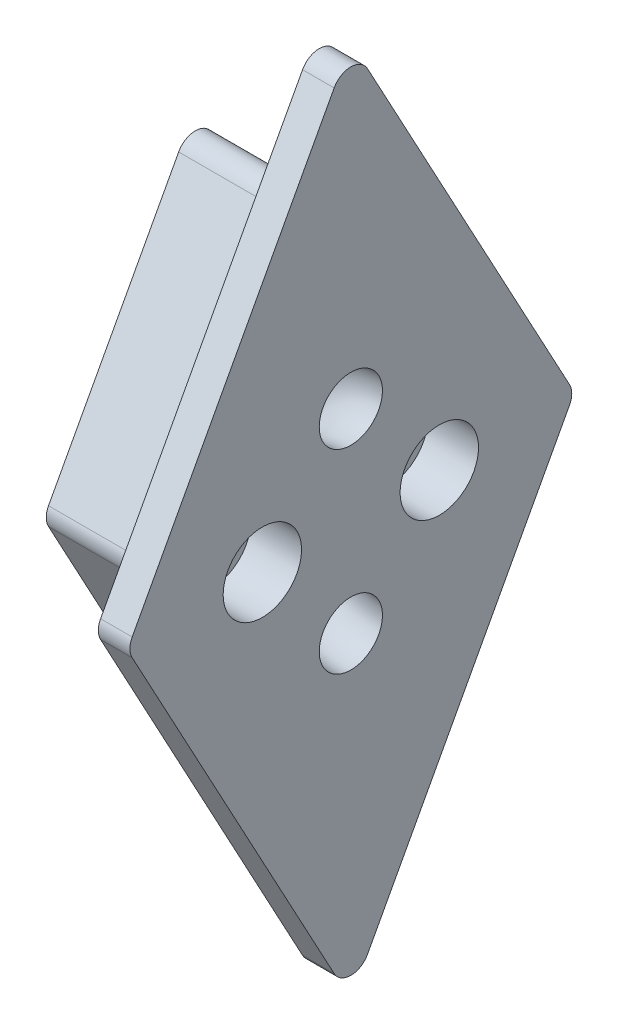
ISO-10303-21;
HEADER;
FILE_DESCRIPTION(('STEP AP214'),'2;1');
FILE_NAME('part.step','',(''),(''),'','','');
FILE_SCHEMA(('AUTOMOTIVE_DESIGN { 1 0 10303 214 1 1 1 1 }'));
ENDSEC;
DATA;
#1=APPLICATION_CONTEXT('core data for automotive mechanical design processes');
#2=APPLICATION_PROTOCOL_DEFINITION('international standard','automotive_design',2000,#1);
#3=PRODUCT_CONTEXT('',#1,'mechanical');
#4=PRODUCT('Part','Part','',(#3));
#5=PRODUCT_RELATED_PRODUCT_CATEGORY('part','',(#4));
#6=PRODUCT_DEFINITION_FORMATION('','',#4);
#7=PRODUCT_DEFINITION_CONTEXT('part definition',#1,'design');
#8=PRODUCT_DEFINITION('design','',#6,#7);
#9=PRODUCT_DEFINITION_SHAPE('','',#8);
#10=(LENGTH_UNIT() NAMED_UNIT(*) SI_UNIT(.MILLI.,.METRE.));
#11=(NAMED_UNIT(*) PLANE_ANGLE_UNIT() SI_UNIT($,.RADIAN.));
#12=(NAMED_UNIT(*) SI_UNIT($,.STERADIAN.) SOLID_ANGLE_UNIT());
#13=UNCERTAINTY_MEASURE_WITH_UNIT(LENGTH_MEASURE(1.E-05),#10,'distance_accuracy_value','');
#14=(GEOMETRIC_REPRESENTATION_CONTEXT(3) GLOBAL_UNCERTAINTY_ASSIGNED_CONTEXT((#13)) GLOBAL_UNIT_ASSIGNED_CONTEXT((#10,
#11,#12)) REPRESENTATION_CONTEXT('',''));
#15=CARTESIAN_POINT('',(0.,0.,0.));
#16=DIRECTION('',(0.,0.,1.));
#17=DIRECTION('',(1.,0.,0.));
#18=AXIS2_PLACEMENT_3D('',#15,#16,#17);
#19=CARTESIAN_POINT('',(12.446,0.,-15.24));
#20=DIRECTION('',(0.,-0.474689449376783,0.880153354052785));
#21=DIRECTION('',(0.,-0.880153354052785,-0.474689449376783));
#22=AXIS2_PLACEMENT_3D('',#19,#20,#21);
#23=PLANE('',#22);
#24=DIRECTION('',(0.,0.880153354052785,0.474689449376783));
#25=VECTOR('',#24,1.);
#26=CARTESIAN_POINT('',(12.446,0.,-15.24));
#27=LINE('',#26,#25);
#28=CARTESIAN_POINT('',(12.446,0.904283401062772,-14.7522965926852));
#29=VERTEX_POINT('',#28);
#30=CARTESIAN_POINT('',(12.446,25.1486333247317,-1.67669213947054));
#31=VERTEX_POINT('',#30);
#32=EDGE_CURVE('E210',#29,#31,#27,.T.);
#33=ORIENTED_EDGE('',*,*,#32,.F.);
#34=DIRECTION('',(-1.,0.,0.));
#35=VECTOR('',#34,1.);
#36=CARTESIAN_POINT('',(12.446,0.904283401062771,-14.7522965926852));
#37=LINE('',#36,#35);
#38=CARTESIAN_POINT('',(0.,0.904283401062772,-14.7522965926852));
#39=VERTEX_POINT('',#38);
#40=EDGE_CURVE('E277',#29,#39,#37,.T.);
#41=ORIENTED_EDGE('',*,*,#40,.T.);
#42=DIRECTION('',(0.,0.880153354052785,0.474689449376783));
#43=VECTOR('',#42,1.);
#44=CARTESIAN_POINT('',(0.,0.,-15.24));
#45=LINE('',#44,#43);
#46=CARTESIAN_POINT('',(0.,25.1486333247317,-1.67669213947054));
#47=VERTEX_POINT('',#46);
#48=EDGE_CURVE('E223',#39,#47,#45,.T.);
#49=ORIENTED_EDGE('',*,*,#48,.T.);
#50=DIRECTION('',(-1.,0.,0.));
#51=VECTOR('',#50,1.);
#52=CARTESIAN_POINT('',(12.446,25.1486333247317,-1.67669213947054));
#53=LINE('',#52,#51);
#54=EDGE_CURVE('E275',#47,#31,#53,.F.);
#55=ORIENTED_EDGE('',*,*,#54,.T.);
#56=EDGE_LOOP('',(#33,#41,#49,#55));
#57=FACE_BOUND('',#56,.T.);
#58=ADVANCED_FACE('F47',(#57),#23,.F.);
#59=CARTESIAN_POINT('',(12.446,0.,15.24));
#60=DIRECTION('',(0.,-0.474689449376783,-0.880153354052785));
#61=DIRECTION('',(0.,0.880153354052785,-0.474689449376783));
#62=AXIS2_PLACEMENT_3D('',#59,#60,#61);
#63=PLANE('',#62);
#64=DIRECTION('',(0.,-0.880153354052785,0.474689449376783));
#65=VECTOR('',#64,1.);
#66=CARTESIAN_POINT('',(0.,0.,15.24));
#67=LINE('',#66,#65);
#68=CARTESIAN_POINT('',(0.,25.1486333247317,1.67669213947056));
#69=VERTEX_POINT('',#68);
#70=CARTESIAN_POINT('',(0.,0.904283401062768,14.7522965926853));
#71=VERTEX_POINT('',#70);
#72=EDGE_CURVE('E226',#69,#71,#67,.T.);
#73=ORIENTED_EDGE('',*,*,#72,.T.);
#74=DIRECTION('',(-1.,0.,0.));
#75=VECTOR('',#74,1.);
#76=CARTESIAN_POINT('',(12.446,0.904283401062769,14.7522965926853));
#77=LINE('',#76,#75);
#78=CARTESIAN_POINT('',(12.446,0.904283401062768,14.7522965926853));
#79=VERTEX_POINT('',#78);
#80=EDGE_CURVE('E282',#71,#79,#77,.F.);
#81=ORIENTED_EDGE('',*,*,#80,.T.);
#82=DIRECTION('',(0.,-0.880153354052785,0.474689449376783));
#83=VECTOR('',#82,1.);
#84=CARTESIAN_POINT('',(12.446,0.,15.24));
#85=LINE('',#84,#83);
#86=CARTESIAN_POINT('',(12.446,25.1486333247317,1.67669213947056));
#87=VERTEX_POINT('',#86);
#88=EDGE_CURVE('E213',#87,#79,#85,.T.);
#89=ORIENTED_EDGE('',*,*,#88,.F.);
#90=DIRECTION('',(-1.,0.,0.));
#91=VECTOR('',#90,1.);
#92=CARTESIAN_POINT('',(12.446,25.1486333247317,1.67669213947056));
#93=LINE('',#92,#91);
#94=EDGE_CURVE('E280',#87,#69,#93,.T.);
#95=ORIENTED_EDGE('',*,*,#94,.T.);
#96=EDGE_LOOP('',(#73,#81,#89,#95));
#97=FACE_BOUND('',#96,.T.);
#98=ADVANCED_FACE('F330',(#97),#63,.F.);
#99=CARTESIAN_POINT('',(12.446,-28.2575,0.));
#100=DIRECTION('',(0.,0.474689449376783,-0.880153354052785));
#101=DIRECTION('',(0.,0.880153354052785,0.474689449376783));
#102=AXIS2_PLACEMENT_3D('',#99,#100,#101);
#103=PLANE('',#102);
#104=DIRECTION('',(0.,-0.880153354052785,-0.474689449376783));
#105=VECTOR('',#104,1.);
#106=CARTESIAN_POINT('',(0.,-28.2575,0.));
#107=LINE('',#106,#105);
#108=CARTESIAN_POINT('',(0.,-0.904283401062779,14.7522965926852));
#109=VERTEX_POINT('',#108);
#110=CARTESIAN_POINT('',(0.,-25.1486333247317,1.67669213947056));
#111=VERTEX_POINT('',#110);
#112=EDGE_CURVE('E228',#109,#111,#107,.T.);
#113=ORIENTED_EDGE('',*,*,#112,.T.);
#114=DIRECTION('',(-1.,0.,0.));
#115=VECTOR('',#114,1.);
#116=CARTESIAN_POINT('',(12.446,-25.1486333247317,1.67669213947056));
#117=LINE('',#116,#115);
#118=CARTESIAN_POINT('',(12.446,-25.1486333247317,1.67669213947056));
#119=VERTEX_POINT('',#118);
#120=EDGE_CURVE('E273',#111,#119,#117,.F.);
#121=ORIENTED_EDGE('',*,*,#120,.T.);
#122=DIRECTION('',(0.,-0.880153354052785,-0.474689449376783));
#123=VECTOR('',#122,1.);
#124=CARTESIAN_POINT('',(12.446,-28.2575,0.));
#125=LINE('',#124,#123);
#126=CARTESIAN_POINT('',(12.446,-0.904283401062779,14.7522965926852));
#127=VERTEX_POINT('',#126);
#128=EDGE_CURVE('E217',#127,#119,#125,.T.);
#129=ORIENTED_EDGE('',*,*,#128,.F.);
#130=DIRECTION('',(-1.,0.,0.));
#131=VECTOR('',#130,1.);
#132=CARTESIAN_POINT('',(12.446,-0.904283401062779,14.7522965926852));
#133=LINE('',#132,#131);
#134=EDGE_CURVE('E270',#127,#109,#133,.T.);
#135=ORIENTED_EDGE('',*,*,#134,.T.);
#136=EDGE_LOOP('',(#113,#121,#129,#135));
#137=FACE_BOUND('',#136,.T.);
#138=ADVANCED_FACE('F336',(#137),#103,.F.);
#139=CARTESIAN_POINT('',(12.446,-28.2575,0.));
#140=DIRECTION('',(0.,0.474689449376783,0.880153354052785));
#141=DIRECTION('',(0.,-0.880153354052785,0.474689449376783));
#142=AXIS2_PLACEMENT_3D('',#139,#140,#141);
#143=PLANE('',#142);
#144=DIRECTION('',(0.,0.880153354052785,-0.474689449376783));
#145=VECTOR('',#144,1.);
#146=CARTESIAN_POINT('',(12.446,-28.2575,0.));
#147=LINE('',#146,#145);
#148=CARTESIAN_POINT('',(12.446,-25.1486333247317,-1.67669213947055));
#149=VERTEX_POINT('',#148);
#150=CARTESIAN_POINT('',(12.446,-0.904283401062765,-14.7522965926852));
#151=VERTEX_POINT('',#150);
#152=EDGE_CURVE('E220',#149,#151,#147,.T.);
#153=ORIENTED_EDGE('',*,*,#152,.F.);
#154=DIRECTION('',(-1.,0.,0.));
#155=VECTOR('',#154,1.);
#156=CARTESIAN_POINT('',(12.446,-25.1486333247317,-1.67669213947055));
#157=LINE('',#156,#155);
#158=CARTESIAN_POINT('',(0.,-25.1486333247317,-1.67669213947055));
#159=VERTEX_POINT('',#158);
#160=EDGE_CURVE('E261',#149,#159,#157,.T.);
#161=ORIENTED_EDGE('',*,*,#160,.T.);
#162=DIRECTION('',(0.,0.880153354052785,-0.474689449376783));
#163=VECTOR('',#162,1.);
#164=CARTESIAN_POINT('',(0.,-28.2575,0.));
#165=LINE('',#164,#163);
#166=CARTESIAN_POINT('',(0.,-0.904283401062765,-14.7522965926852));
#167=VERTEX_POINT('',#166);
#168=EDGE_CURVE('E214',#159,#167,#165,.T.);
#169=ORIENTED_EDGE('',*,*,#168,.T.);
#170=DIRECTION('',(-1.,0.,0.));
#171=VECTOR('',#170,1.);
#172=CARTESIAN_POINT('',(12.446,-0.904283401062769,-14.7522965926852));
#173=LINE('',#172,#171);
#174=EDGE_CURVE('E259',#167,#151,#173,.F.);
#175=ORIENTED_EDGE('',*,*,#174,.T.);
#176=EDGE_LOOP('',(#153,#161,#169,#175));
#177=FACE_BOUND('',#176,.T.);
#178=ADVANCED_FACE('F381',(#177),#143,.F.);
#179=CARTESIAN_POINT('',(0.,0.,0.));
#180=DIRECTION('',(-1.,0.,0.));
#181=DIRECTION('',(0.,0.,1.));
#182=AXIS2_PLACEMENT_3D('',#179,#180,#181);
#183=PLANE('',#182);
#184=CARTESIAN_POINT('',(0.,0.,-8.89));
#185=DIRECTION('',(1.,0.,0.));
#186=DIRECTION('',(0.,0.,-1.));
#187=AXIS2_PLACEMENT_3D('',#184,#185,#186);
#188=CIRCLE('',#187,2.5527);
#189=CARTESIAN_POINT('',(0.,0.,-11.4427));
#190=VERTEX_POINT('',#189);
#191=EDGE_CURVE('E615',#190,#190,#188,.T.);
#192=ORIENTED_EDGE('',*,*,#191,.T.);
#193=EDGE_LOOP('',(#192));
#194=FACE_BOUND('',#193,.T.);
#195=CARTESIAN_POINT('',(0.,0.,8.89));
#196=DIRECTION('',(1.,0.,0.));
#197=DIRECTION('',(0.,0.,1.));
#198=AXIS2_PLACEMENT_3D('',#195,#196,#197);
#199=CIRCLE('',#198,2.5527);
#200=CARTESIAN_POINT('',(0.,0.,11.4427));
#201=VERTEX_POINT('',#200);
#202=EDGE_CURVE('E620',#201,#201,#199,.T.);
#203=ORIENTED_EDGE('',*,*,#202,.T.);
#204=EDGE_LOOP('',(#203));
#205=FACE_BOUND('',#204,.T.);
#206=ORIENTED_EDGE('',*,*,#168,.F.);
#207=CARTESIAN_POINT('',(0.,-24.2443499236689,0.));
#208=DIRECTION('',(-1.,0.,0.));
#209=DIRECTION('',(0.,0.,1.));
#210=AXIS2_PLACEMENT_3D('',#207,#208,#209);
#211=CIRCLE('',#210,1.905);
#212=EDGE_CURVE('E268',#159,#111,#211,.T.);
#213=ORIENTED_EDGE('',*,*,#212,.T.);
#214=ORIENTED_EDGE('',*,*,#112,.F.);
#215=CARTESIAN_POINT('',(0.,0.,13.0756044532147));
#216=DIRECTION('',(-1.,0.,0.));
#217=DIRECTION('',(0.,0.,1.));
#218=AXIS2_PLACEMENT_3D('',#215,#216,#217);
#219=CIRCLE('',#218,1.905);
#220=EDGE_CURVE('E69',#109,#71,#219,.T.);
#221=ORIENTED_EDGE('',*,*,#220,.T.);
#222=ORIENTED_EDGE('',*,*,#72,.F.);
#223=CARTESIAN_POINT('',(0.,24.2443499236689,0.));
#224=DIRECTION('',(-1.,0.,0.));
#225=DIRECTION('',(0.,0.,1.));
#226=AXIS2_PLACEMENT_3D('',#223,#224,#225);
#227=CIRCLE('',#226,1.905);
#228=EDGE_CURVE('E77',#69,#47,#227,.T.);
#229=ORIENTED_EDGE('',*,*,#228,.T.);
#230=ORIENTED_EDGE('',*,*,#48,.F.);
#231=CARTESIAN_POINT('',(0.,0.,-13.0756044532147));
#232=DIRECTION('',(-1.,0.,0.));
#233=DIRECTION('',(0.,0.,1.));
#234=AXIS2_PLACEMENT_3D('',#231,#232,#233);
#235=CIRCLE('',#234,1.905);
#236=EDGE_CURVE('E266',#39,#167,#235,.T.);
#237=ORIENTED_EDGE('',*,*,#236,.T.);
#238=EDGE_LOOP('',(#206,#213,#214,#221,#222,#229,#230,#237));
#239=FACE_BOUND('',#238,.T.);
#240=ADVANCED_FACE('F387',(#194,#205,#239),#183,.T.);
#241=CARTESIAN_POINT('',(12.446,0.,0.));
#242=DIRECTION('',(1.,0.,0.));
#243=DIRECTION('',(0.,0.,-1.));
#244=AXIS2_PLACEMENT_3D('',#241,#242,#243);
#245=PLANE('',#244);
#246=DIRECTION('',(0.,-0.880153354052785,0.474689449376783));
#247=VECTOR('',#246,1.);
#248=CARTESIAN_POINT('',(12.446,41.6346669211036,0.));
#249=LINE('',#248,#247);
#250=CARTESIAN_POINT('',(12.446,38.5258002458353,1.67669213947057));
#251=VERTEX_POINT('',#250);
#252=CARTESIAN_POINT('',(12.446,0.904283401062758,21.966948415303));
#253=VERTEX_POINT('',#252);
#254=EDGE_CURVE('E185',#251,#253,#249,.T.);
#255=ORIENTED_EDGE('',*,*,#254,.F.);
#256=CARTESIAN_POINT('',(12.446,37.6215168447726,0.));
#257=DIRECTION('',(1.,0.,0.));
#258=DIRECTION('',(0.,0.,-1.));
#259=AXIS2_PLACEMENT_3D('',#256,#257,#258);
#260=CIRCLE('',#259,1.905);
#261=CARTESIAN_POINT('',(12.446,38.5258002458353,-1.67669213947055));
#262=VERTEX_POINT('',#261);
#263=EDGE_CURVE('E168',#251,#262,#260,.F.);
#264=ORIENTED_EDGE('',*,*,#263,.T.);
#265=DIRECTION('',(0.,0.880153354052785,0.474689449376783));
#266=VECTOR('',#265,1.);
#267=CARTESIAN_POINT('',(12.446,0.,-22.4546518226177));
#268=LINE('',#267,#266);
#269=CARTESIAN_POINT('',(12.446,0.904283401062774,-21.9669484153029));
#270=VERTEX_POINT('',#269);
#271=EDGE_CURVE('E208',#270,#262,#268,.T.);
#272=ORIENTED_EDGE('',*,*,#271,.F.);
#273=CARTESIAN_POINT('',(12.446,0.,-20.2902562758324));
#274=DIRECTION('',(1.,0.,0.));
#275=DIRECTION('',(0.,0.,-1.));
#276=AXIS2_PLACEMENT_3D('',#273,#274,#275);
#277=CIRCLE('',#276,1.905);
#278=CARTESIAN_POINT('',(12.446,-0.904283401062765,-21.9669484153029));
#279=VERTEX_POINT('',#278);
#280=EDGE_CURVE('E189',#270,#279,#277,.F.);
#281=ORIENTED_EDGE('',*,*,#280,.T.);
#282=DIRECTION('',(0.,0.880153354052785,-0.474689449376783));
#283=VECTOR('',#282,1.);
#284=CARTESIAN_POINT('',(12.446,-41.6346669211036,0.));
#285=LINE('',#284,#283);
#286=CARTESIAN_POINT('',(12.446,-38.5258002458353,-1.67669213947054));
#287=VERTEX_POINT('',#286);
#288=EDGE_CURVE('E198',#287,#279,#285,.T.);
#289=ORIENTED_EDGE('',*,*,#288,.F.);
#290=CARTESIAN_POINT('',(12.446,-37.6215168447725,0.));
#291=DIRECTION('',(1.,0.,0.));
#292=DIRECTION('',(0.,0.,-1.));
#293=AXIS2_PLACEMENT_3D('',#290,#291,#292);
#294=CIRCLE('',#293,1.905);
#295=CARTESIAN_POINT('',(12.446,-38.5258002458353,1.67669213947056));
#296=VERTEX_POINT('',#295);
#297=EDGE_CURVE('E235',#287,#296,#294,.F.);
#298=ORIENTED_EDGE('',*,*,#297,.T.);
#299=DIRECTION('',(0.,-0.880153354052785,-0.474689449376783));
#300=VECTOR('',#299,1.);
#301=CARTESIAN_POINT('',(12.446,0.,22.4546518226177));
#302=LINE('',#301,#300);
#303=CARTESIAN_POINT('',(12.446,-0.904283401062773,21.9669484153029));
#304=VERTEX_POINT('',#303);
#305=EDGE_CURVE('E195',#304,#296,#302,.T.);
#306=ORIENTED_EDGE('',*,*,#305,.F.);
#307=CARTESIAN_POINT('',(12.446,0.,20.2902562758324));
#308=DIRECTION('',(1.,0.,0.));
#309=DIRECTION('',(0.,0.,-1.));
#310=AXIS2_PLACEMENT_3D('',#307,#308,#309);
#311=CIRCLE('',#310,1.905);
#312=EDGE_CURVE('E179',#304,#253,#311,.F.);
#313=ORIENTED_EDGE('',*,*,#312,.T.);
#314=EDGE_LOOP('',(#255,#264,#272,#281,#289,#298,#306,#313));
#315=FACE_BOUND('',#314,.T.);
#316=ORIENTED_EDGE('',*,*,#128,.T.);
#317=CARTESIAN_POINT('',(12.446,-24.2443499236689,0.));
#318=DIRECTION('',(1.,0.,0.));
#319=DIRECTION('',(0.,0.,-1.));
#320=AXIS2_PLACEMENT_3D('',#317,#318,#319);
#321=CIRCLE('',#320,1.905);
#322=EDGE_CURVE('E284',#119,#149,#321,.T.);
#323=ORIENTED_EDGE('',*,*,#322,.T.);
#324=ORIENTED_EDGE('',*,*,#152,.T.);
#325=CARTESIAN_POINT('',(12.446,0.,-13.0756044532147));
#326=DIRECTION('',(1.,0.,0.));
#327=DIRECTION('',(0.,0.,-1.));
#328=AXIS2_PLACEMENT_3D('',#325,#326,#327);
#329=CIRCLE('',#328,1.905);
#330=EDGE_CURVE('E286',#151,#29,#329,.T.);
#331=ORIENTED_EDGE('',*,*,#330,.T.);
#332=ORIENTED_EDGE('',*,*,#32,.T.);
#333=CARTESIAN_POINT('',(12.446,24.2443499236689,0.));
#334=DIRECTION('',(1.,0.,0.));
#335=DIRECTION('',(0.,0.,-1.));
#336=AXIS2_PLACEMENT_3D('',#333,#334,#335);
#337=CIRCLE('',#336,1.905);
#338=EDGE_CURVE('E11',#31,#87,#337,.T.);
#339=ORIENTED_EDGE('',*,*,#338,.T.);
#340=ORIENTED_EDGE('',*,*,#88,.T.);
#341=CARTESIAN_POINT('',(12.446,0.,13.0756044532147));
#342=DIRECTION('',(1.,0.,0.));
#343=DIRECTION('',(0.,0.,-1.));
#344=AXIS2_PLACEMENT_3D('',#341,#342,#343);
#345=CIRCLE('',#344,1.905);
#346=EDGE_CURVE('E61',#79,#127,#345,.T.);
#347=ORIENTED_EDGE('',*,*,#346,.T.);
#348=EDGE_LOOP('',(#316,#323,#324,#331,#332,#339,#340,#347));
#349=FACE_BOUND('',#348,.T.);
#350=ADVANCED_FACE('F192',(#315,#349),#245,.F.);
#351=CARTESIAN_POINT('',(15.621,41.6346669211036,0.));
#352=DIRECTION('',(0.,-0.474689449376783,-0.880153354052785));
#353=DIRECTION('',(0.,0.880153354052785,-0.474689449376783));
#354=AXIS2_PLACEMENT_3D('',#351,#352,#353);
#355=PLANE('',#354);
#356=DIRECTION('',(0.,-0.880153354052785,0.474689449376783));
#357=VECTOR('',#356,1.);
#358=CARTESIAN_POINT('',(15.621,41.6346669211036,0.));
#359=LINE('',#358,#357);
#360=CARTESIAN_POINT('',(15.621,38.5258002458353,1.67669213947057));
#361=VERTEX_POINT('',#360);
#362=CARTESIAN_POINT('',(15.621,0.904283401062758,21.966948415303));
#363=VERTEX_POINT('',#362);
#364=EDGE_CURVE('E188',#361,#363,#359,.T.);
#365=ORIENTED_EDGE('',*,*,#364,.F.);
#366=DIRECTION('',(-1.,0.,0.));
#367=VECTOR('',#366,1.);
#368=CARTESIAN_POINT('',(15.621,38.5258002458353,1.67669213947057));
#369=LINE('',#368,#367);
#370=EDGE_CURVE('E172',#361,#251,#369,.T.);
#371=ORIENTED_EDGE('',*,*,#370,.T.);
#372=ORIENTED_EDGE('',*,*,#254,.T.);
#373=DIRECTION('',(-1.,0.,0.));
#374=VECTOR('',#373,1.);
#375=CARTESIAN_POINT('',(15.621,0.904283401062765,21.9669484153029));
#376=LINE('',#375,#374);
#377=EDGE_CURVE('E190',#253,#363,#376,.F.);
#378=ORIENTED_EDGE('',*,*,#377,.T.);
#379=EDGE_LOOP('',(#365,#371,#372,#378));
#380=FACE_BOUND('',#379,.T.);
#381=ADVANCED_FACE('F184',(#380),#355,.F.);
#382=CARTESIAN_POINT('',(15.621,0.,22.4546518226177));
#383=DIRECTION('',(0.,0.474689449376783,-0.880153354052785));
#384=DIRECTION('',(0.,0.880153354052785,0.474689449376783));
#385=AXIS2_PLACEMENT_3D('',#382,#383,#384);
#386=PLANE('',#385);
#387=DIRECTION('',(0.,-0.880153354052785,-0.474689449376783));
#388=VECTOR('',#387,1.);
#389=CARTESIAN_POINT('',(15.621,0.,22.4546518226177));
#390=LINE('',#389,#388);
#391=CARTESIAN_POINT('',(15.621,-0.904283401062773,21.9669484153029));
#392=VERTEX_POINT('',#391);
#393=CARTESIAN_POINT('',(15.621,-38.5258002458353,1.67669213947056));
#394=VERTEX_POINT('',#393);
#395=EDGE_CURVE('E606',#392,#394,#390,.T.);
#396=ORIENTED_EDGE('',*,*,#395,.F.);
#397=DIRECTION('',(-1.,0.,0.));
#398=VECTOR('',#397,1.);
#399=CARTESIAN_POINT('',(15.621,-0.904283401062773,21.9669484153029));
#400=LINE('',#399,#398);
#401=EDGE_CURVE('E251',#392,#304,#400,.T.);
#402=ORIENTED_EDGE('',*,*,#401,.T.);
#403=ORIENTED_EDGE('',*,*,#305,.T.);
#404=DIRECTION('',(-1.,0.,0.));
#405=VECTOR('',#404,1.);
#406=CARTESIAN_POINT('',(15.621,-38.5258002458353,1.67669213947057));
#407=LINE('',#406,#405);
#408=EDGE_CURVE('E249',#296,#394,#407,.F.);
#409=ORIENTED_EDGE('',*,*,#408,.T.);
#410=EDGE_LOOP('',(#396,#402,#403,#409));
#411=FACE_BOUND('',#410,.T.);
#412=ADVANCED_FACE('F422',(#411),#386,.F.);
#413=CARTESIAN_POINT('',(15.621,-41.6346669211036,0.));
#414=DIRECTION('',(0.,0.474689449376783,0.880153354052785));
#415=DIRECTION('',(0.,-0.880153354052785,0.474689449376783));
#416=AXIS2_PLACEMENT_3D('',#413,#414,#415);
#417=PLANE('',#416);
#418=DIRECTION('',(0.,0.880153354052785,-0.474689449376783));
#419=VECTOR('',#418,1.);
#420=CARTESIAN_POINT('',(15.621,-41.6346669211036,0.));
#421=LINE('',#420,#419);
#422=CARTESIAN_POINT('',(15.621,-38.5258002458353,-1.67669213947054));
#423=VERTEX_POINT('',#422);
#424=CARTESIAN_POINT('',(15.621,-0.904283401062765,-21.9669484153029));
#425=VERTEX_POINT('',#424);
#426=EDGE_CURVE('E605',#423,#425,#421,.T.);
#427=ORIENTED_EDGE('',*,*,#426,.F.);
#428=DIRECTION('',(-1.,0.,0.));
#429=VECTOR('',#428,1.);
#430=CARTESIAN_POINT('',(15.621,-38.5258002458353,-1.67669213947054));
#431=LINE('',#430,#429);
#432=EDGE_CURVE('E256',#423,#287,#431,.T.);
#433=ORIENTED_EDGE('',*,*,#432,.T.);
#434=ORIENTED_EDGE('',*,*,#288,.T.);
#435=DIRECTION('',(-1.,0.,0.));
#436=VECTOR('',#435,1.);
#437=CARTESIAN_POINT('',(15.621,-0.904283401062772,-21.9669484153029));
#438=LINE('',#437,#436);
#439=EDGE_CURVE('E254',#279,#425,#438,.F.);
#440=ORIENTED_EDGE('',*,*,#439,.T.);
#441=EDGE_LOOP('',(#427,#433,#434,#440));
#442=FACE_BOUND('',#441,.T.);
#443=ADVANCED_FACE('F429',(#442),#417,.F.);
#444=CARTESIAN_POINT('',(15.621,0.,-22.4546518226177));
#445=DIRECTION('',(0.,-0.474689449376783,0.880153354052785));
#446=DIRECTION('',(0.,-0.880153354052785,-0.474689449376783));
#447=AXIS2_PLACEMENT_3D('',#444,#445,#446);
#448=PLANE('',#447);
#449=ORIENTED_EDGE('',*,*,#271,.T.);
#450=DIRECTION('',(-1.,0.,0.));
#451=VECTOR('',#450,1.);
#452=CARTESIAN_POINT('',(15.621,38.5258002458353,-1.67669213947055));
#453=LINE('',#452,#451);
#454=CARTESIAN_POINT('',(15.621,38.5258002458353,-1.67669213947055));
#455=VERTEX_POINT('',#454);
#456=EDGE_CURVE('E173',#262,#455,#453,.F.);
#457=ORIENTED_EDGE('',*,*,#456,.T.);
#458=DIRECTION('',(0.,0.880153354052785,0.474689449376783));
#459=VECTOR('',#458,1.);
#460=CARTESIAN_POINT('',(15.621,0.,-22.4546518226177));
#461=LINE('',#460,#459);
#462=CARTESIAN_POINT('',(15.621,0.904283401062774,-21.9669484153029));
#463=VERTEX_POINT('',#462);
#464=EDGE_CURVE('E203',#463,#455,#461,.T.);
#465=ORIENTED_EDGE('',*,*,#464,.F.);
#466=DIRECTION('',(-1.,0.,0.));
#467=VECTOR('',#466,1.);
#468=CARTESIAN_POINT('',(15.621,0.904283401062773,-21.9669484153029));
#469=LINE('',#468,#467);
#470=EDGE_CURVE('E178',#463,#270,#469,.T.);
#471=ORIENTED_EDGE('',*,*,#470,.T.);
#472=EDGE_LOOP('',(#449,#457,#465,#471));
#473=FACE_BOUND('',#472,.T.);
#474=ADVANCED_FACE('F437',(#473),#448,.F.);
#475=CARTESIAN_POINT('',(15.621,0.,0.));
#476=DIRECTION('',(1.,0.,0.));
#477=DIRECTION('',(0.,0.,-1.));
#478=AXIS2_PLACEMENT_3D('',#475,#476,#477);
#479=PLANE('',#478);
#480=CARTESIAN_POINT('',(15.621,0.,-8.89));
#481=DIRECTION('',(1.,0.,0.));
#482=DIRECTION('',(0.,0.,-1.));
#483=AXIS2_PLACEMENT_3D('',#480,#481,#482);
#484=CIRCLE('',#483,3.937);
#485=CARTESIAN_POINT('',(15.621,0.,-12.827));
#486=VERTEX_POINT('',#485);
#487=EDGE_CURVE('E591',#486,#486,#484,.T.);
#488=ORIENTED_EDGE('',*,*,#487,.F.);
#489=EDGE_LOOP('',(#488));
#490=FACE_BOUND('',#489,.T.);
#491=CARTESIAN_POINT('',(15.621,0.,8.89));
#492=DIRECTION('',(1.,0.,0.));
#493=DIRECTION('',(0.,0.,1.));
#494=AXIS2_PLACEMENT_3D('',#491,#492,#493);
#495=CIRCLE('',#494,3.937);
#496=CARTESIAN_POINT('',(15.621,0.,12.827));
#497=VERTEX_POINT('',#496);
#498=EDGE_CURVE('E595',#497,#497,#495,.T.);
#499=ORIENTED_EDGE('',*,*,#498,.F.);
#500=EDGE_LOOP('',(#499));
#501=FACE_BOUND('',#500,.T.);
#502=CARTESIAN_POINT('',(15.621,-12.4135868378106,-1.76801566120139));
#503=CARTESIAN_POINT('',(15.621,-12.314243837278,-1.91615117978333));
#504=CARTESIAN_POINT('',(15.621,-12.2023162917932,-2.05600393966918));
#505=CARTESIAN_POINT('',(15.621,-11.9564728011659,-2.31504526721387));
#506=CARTESIAN_POINT('',(15.621,-11.8225304915794,-2.43420870152909));
#507=CARTESIAN_POINT('',(15.621,-11.5365916378765,-2.64830558506955));
#508=CARTESIAN_POINT('',(15.621,-11.3846039209809,-2.74325081006893));
#509=CARTESIAN_POINT('',(15.621,-11.066889207208,-2.90625448670748));
#510=CARTESIAN_POINT('',(15.621,-10.9011656322083,-2.97431961050679));
#511=CARTESIAN_POINT('',(15.621,-10.5605976533716,-3.08169070036157));
#512=CARTESIAN_POINT('',(15.621,-10.3857506861405,-3.12098853656804));
#513=CARTESIAN_POINT('',(15.621,-10.0319346826767,-3.16968209969499));
#514=CARTESIAN_POINT('',(15.621,-9.85296547853865,-3.17907660642721));
#515=CARTESIAN_POINT('',(15.621,-9.49594329364677,-3.16769616843078));
#516=CARTESIAN_POINT('',(15.621,-9.31789055720216,-3.14691355879415));
#517=CARTESIAN_POINT('',(15.621,-8.96779980415432,-3.07575716335539));
#518=CARTESIAN_POINT('',(15.621,-8.79576178499713,-3.02538339011836));
#519=CARTESIAN_POINT('',(15.621,-8.46254748706588,-2.89646147276431));
#520=CARTESIAN_POINT('',(15.621,-8.30137341749825,-2.81790761857938));
#521=CARTESIAN_POINT('',(15.621,-7.99450151305848,-2.63485538189413));
#522=CARTESIAN_POINT('',(15.621,-7.84880365974933,-2.5303570303023));
#523=CARTESIAN_POINT('',(15.621,-7.57702858353242,-2.29838290985283));
#524=CARTESIAN_POINT('',(15.621,-7.45095063780883,-2.17090798784722));
#525=CARTESIAN_POINT('',(15.621,-7.22199568586762,-1.89659304207874));
#526=CARTESIAN_POINT('',(15.621,-7.1191186598427,-1.74975303484859));
#527=CARTESIAN_POINT('',(15.621,-6.93953467226444,-1.4409391220973));
#528=CARTESIAN_POINT('',(15.621,-6.86281695929033,-1.27897146895797));
#529=CARTESIAN_POINT('',(15.621,-6.73768270119293,-0.944449662317937));
#530=CARTESIAN_POINT('',(15.621,-6.68926602386323,-0.771895558275293));
#531=CARTESIAN_POINT('',(15.621,-6.62213963024707,-0.421218804082754));
#532=CARTESIAN_POINT('',(15.621,-6.6034106915383,-0.24309983336921));
#533=CARTESIAN_POINT('',(15.621,-6.5961349396927,0.113753242140352));
#534=CARTESIAN_POINT('',(15.621,-6.60758804671761,0.292487345307959));
#535=CARTESIAN_POINT('',(15.621,-6.66033864858326,0.645426178548322));
#536=CARTESIAN_POINT('',(15.621,-6.70162485847488,0.819632595499986));
#537=CARTESIAN_POINT('',(15.621,-6.8128503793938,1.15864443341592));
#538=CARTESIAN_POINT('',(15.621,-6.88278972673167,1.3234498424665));
#539=CARTESIAN_POINT('',(15.621,-7.04935095406414,1.63903120614718));
#540=CARTESIAN_POINT('',(15.621,-7.14597994689089,1.78980340656467));
#541=CARTESIAN_POINT('',(15.621,-7.36316359792277,2.07299900020818));
#542=CARTESIAN_POINT('',(15.621,-7.48371833908095,2.20542232981406));
#543=CARTESIAN_POINT('',(15.621,-7.74541467395944,2.44825072861921));
#544=CARTESIAN_POINT('',(15.621,-7.88656940736398,2.55864163725552));
#545=CARTESIAN_POINT('',(15.621,-8.18540104350197,2.75417249233478));
#546=CARTESIAN_POINT('',(15.621,-8.34307798923229,2.83931237306305));
#547=CARTESIAN_POINT('',(15.621,-8.67056067792213,2.98196346362545));
#548=CARTESIAN_POINT('',(15.621,-8.84037220283557,3.0394614002712));
#549=CARTESIAN_POINT('',(15.621,-9.18723774009242,3.12513575978206));
#550=CARTESIAN_POINT('',(15.621,-9.36429176190861,3.15331214429496));
#551=CARTESIAN_POINT('',(15.621,-9.72063612406391,3.17954288091157));
#552=CARTESIAN_POINT('',(15.621,-9.89992669664601,3.17759407836345));
#553=CARTESIAN_POINT('',(15.621,-10.2556348765284,3.14361857934632));
#554=CARTESIAN_POINT('',(15.621,-10.4320524886461,3.11159193331758));
#555=CARTESIAN_POINT('',(15.621,-10.7769747934556,3.0183742715096));
#556=CARTESIAN_POINT('',(15.621,-10.9454808133481,2.95718816668443));
#557=CARTESIAN_POINT('',(15.621,-11.2698250314311,2.80738704518639));
#558=CARTESIAN_POINT('',(15.621,-11.4256632233653,2.71877201496704));
#559=CARTESIAN_POINT('',(15.621,-11.7202027248366,2.51665431950953));
#560=CARTESIAN_POINT('',(15.621,-11.8589086575062,2.40315839141074));
#561=CARTESIAN_POINT('',(15.621,-12.1152916490544,2.15448510000523));
#562=CARTESIAN_POINT('',(15.621,-12.2329686941717,2.01930772251028));
#563=CARTESIAN_POINT('',(15.621,-12.4439240538214,1.7311433745554));
#564=CARTESIAN_POINT('',(15.621,-12.5372080707616,1.57816057861055));
#565=CARTESIAN_POINT('',(15.621,-12.6967591706919,1.25870888372796));
#566=CARTESIAN_POINT('',(15.621,-12.7630273431821,1.09224052896297));
#567=CARTESIAN_POINT('',(15.621,-12.8666545890356,0.750589824797912));
#568=CARTESIAN_POINT('',(15.621,-12.9040219180886,0.575409979113789));
#569=CARTESIAN_POINT('',(15.621,-12.9488199867068,0.221214909297072));
#570=CARTESIAN_POINT('',(15.621,-12.9562432985996,0.0421987446272388));
#571=CARTESIAN_POINT('',(15.621,-12.940929662659,-0.314591669055827));
#572=CARTESIAN_POINT('',(15.621,-12.9181809903864,-0.492365408288176));
#573=CARTESIAN_POINT('',(15.621,-12.8431544178598,-0.841414569547838));
#574=CARTESIAN_POINT('',(15.621,-12.7909120927493,-1.01269755558344));
#575=CARTESIAN_POINT('',(15.621,-12.6834029200639,-1.2816880628344));
#576=CARTESIAN_POINT('',(15.621,-12.6366339665755,-1.38287743134872));
#577=CARTESIAN_POINT('',(15.621,-12.5327411220306,-1.5797928563694));
#578=CARTESIAN_POINT('',(15.621,-12.4756172312687,-1.67551891303107));
#579=CARTESIAN_POINT('',(15.621,-12.4135868378106,-1.76801566120139));
#580=B_SPLINE_CURVE_WITH_KNOTS('',3,(#502,#503,#504,#505,#506,#507,#508,#509,#510,#511,#512,
#513,#514,#515,#516,#517,#518,#519,#520,#521,#522,#523,#524,#525,#526,#527,#528,#529,#530,#531,
#532,#533,#534,#535,#536,#537,#538,#539,#540,#541,#542,#543,#544,#545,#546,#547,#548,#549,#550,
#551,#552,#553,#554,#555,#556,#557,#558,#559,#560,#561,#562,#563,#564,#565,#566,#567,#568,#569,
#570,#571,#572,#573,#574,#575,#576,#577,#578,#579),.UNSPECIFIED.,.T.,.F.,(4,2,2,2,2,2,2,2,2,2,2,
2,2,2,2,2,2,2,2,2,2,2,2,2,2,2,2,2,2,2,2,2,2,2,2,2,2,2,4),(0.,0.534680733928752,1.07000651994067,
1.60507151275659,2.14000360850611,2.67508682173511,3.21019186844871,3.74543285421048,
4.28067361269663,4.81602288715815,5.35137152384431,5.88670043311252,6.42202888535299,
6.95713705281587,7.4922427205365,8.02700177260473,8.56175941011728,9.0963148710157,
9.63087100932952,10.165569745371,10.7002703353006,11.2353134863107,11.7703580297346,
12.3056592364054,12.840961143242,13.3763191062477,13.9116761714645,14.4469431051953,
14.9822103032815,15.5173327427138,16.052455532329,16.587453113135,17.1224291163229,
17.6572522440853,18.1922080276221,18.7273717489091,19.2618913324927,19.5957493503212,
19.9296073586581),.UNSPECIFIED.);
#581=CARTESIAN_POINT('',(15.621,-12.4135868378106,-1.76801566120139));
#582=VERTEX_POINT('',#581);
#583=EDGE_CURVE('E51',#582,#582,#580,.T.);
#584=ORIENTED_EDGE('',*,*,#583,.F.);
#585=EDGE_LOOP('',(#584));
#586=FACE_BOUND('',#585,.T.);
#587=CARTESIAN_POINT('',(15.621,6.81264677070188,-1.14430451636843));
#588=CARTESIAN_POINT('',(15.621,6.87697906538559,-1.31066787648756));
#589=CARTESIAN_POINT('',(15.621,6.95541487499107,-1.47171729820434));
#590=CARTESIAN_POINT('',(15.621,7.13828434860063,-1.77849123434184));
#591=CARTESIAN_POINT('',(15.621,7.24274940076866,-1.92419694206677));
#592=CARTESIAN_POINT('',(15.621,7.47461614977267,-2.19594079122293));
#593=CARTESIAN_POINT('',(15.621,7.60200626958064,-2.32198879998277));
#594=CARTESIAN_POINT('',(15.621,7.87609788722051,-2.55088361815681));
#595=CARTESIAN_POINT('',(15.621,8.02279457786098,-2.65373618581959));
#596=CARTESIAN_POINT('',(15.621,8.33144469271635,-2.83342127289919));
#597=CARTESIAN_POINT('',(15.621,8.49340600797836,-2.91024023890148));
#598=CARTESIAN_POINT('',(15.621,8.82793098012273,-3.03560697831218));
#599=CARTESIAN_POINT('',(15.621,9.00049507007638,-3.08415359608423));
#600=CARTESIAN_POINT('',(15.621,9.35136149648039,-3.15160026027215));
#601=CARTESIAN_POINT('',(15.621,9.5296650550513,-3.17049394942149));
#602=CARTESIAN_POINT('',(15.621,9.88691297392981,-3.17807557326255));
#603=CARTESIAN_POINT('',(15.621,10.0658573328562,-3.16676357302417));
#604=CARTESIAN_POINT('',(15.621,10.4192894127146,-3.11425395653847));
#605=CARTESIAN_POINT('',(15.621,10.5937775436069,-3.07305909975523));
#606=CARTESIAN_POINT('',(15.621,10.9333578308134,-2.96195271070512));
#607=CARTESIAN_POINT('',(15.621,11.0984500152117,-2.8920412642759));
#608=CARTESIAN_POINT('',(15.621,11.4145079656421,-2.72550467561894));
#609=CARTESIAN_POINT('',(15.621,11.5654772563636,-2.62888622266607));
#610=CARTESIAN_POINT('',(15.621,11.8490466551626,-2.41166862228997));
#611=CARTESIAN_POINT('',(15.621,11.981646769231,-2.29106948268782));
#612=CARTESIAN_POINT('',(15.621,12.2246761521391,-2.02934892554679));
#613=CARTESIAN_POINT('',(15.621,12.3351113377356,-1.88823300219614));
#614=CARTESIAN_POINT('',(15.621,12.5307169493465,-1.58946044097313));
#615=CARTESIAN_POINT('',(15.621,12.6158874155175,-1.43180382939171));
#616=CARTESIAN_POINT('',(15.621,12.7585278884561,-1.10446088904256));
#617=CARTESIAN_POINT('',(15.621,12.8160036866641,-0.934777083892813));
#618=CARTESIAN_POINT('',(15.621,12.9016481202959,-0.588167891350983));
#619=CARTESIAN_POINT('',(15.621,12.9298167748071,-0.411242508675332));
#620=CARTESIAN_POINT('',(15.621,12.9560448143805,-0.0551956642340016));
#621=CARTESIAN_POINT('',(15.621,12.9541078700694,0.123925527146637));
#622=CARTESIAN_POINT('',(15.621,12.9201887324745,0.479300146881316));
#623=CARTESIAN_POINT('',(15.621,12.8882065501111,0.65555357627767));
#624=CARTESIAN_POINT('',(15.621,12.7951068217435,1.00018498762172));
#625=CARTESIAN_POINT('',(15.621,12.7339900078432,1.16856316734438));
#626=CARTESIAN_POINT('',(15.621,12.5843575388305,1.49267004403332));
#627=CARTESIAN_POINT('',(15.621,12.4958418778659,1.64839873829775));
#628=CARTESIAN_POINT('',(15.621,12.293918428255,1.94279877181589));
#629=CARTESIAN_POINT('',(15.621,12.1805088238425,2.08146886566193));
#630=CARTESIAN_POINT('',(15.621,11.9320221030041,2.33780483211365));
#631=CARTESIAN_POINT('',(15.621,11.7969449749672,2.45547069346369));
#632=CARTESIAN_POINT('',(15.621,11.5089341443086,2.66647975995359));
#633=CARTESIAN_POINT('',(15.621,11.3559974718142,2.75981891142854));
#634=CARTESIAN_POINT('',(15.621,11.0366274212975,2.91950367697944));
#635=CARTESIAN_POINT('',(15.621,10.8701940221708,2.98584924884529));
#636=CARTESIAN_POINT('',(15.621,10.5285119135742,3.08968117258056));
#637=CARTESIAN_POINT('',(15.621,10.353261065323,3.12716048627857));
#638=CARTESIAN_POINT('',(15.621,9.99895515890364,3.17217371624648));
#639=CARTESIAN_POINT('',(15.621,9.81990009885597,3.17970761772124));
#640=CARTESIAN_POINT('',(15.621,9.46301645256763,3.1646178114626));
#641=CARTESIAN_POINT('',(15.621,9.28518821313762,3.14198590115513));
#642=CARTESIAN_POINT('',(15.621,8.93585301345613,3.06719461923203));
#643=CARTESIAN_POINT('',(15.621,8.76434607453877,3.01503514797198));
#644=CARTESIAN_POINT('',(15.621,8.43248780930573,2.88265621155895));
#645=CARTESIAN_POINT('',(15.621,8.27213865725694,2.80243129567731));
#646=CARTESIAN_POINT('',(15.621,7.9671850127334,2.61619855945622));
#647=CARTESIAN_POINT('',(15.621,7.82258056054549,2.5101906731467));
#648=CARTESIAN_POINT('',(15.621,7.55322947819205,2.27540129611608));
#649=CARTESIAN_POINT('',(15.621,7.42848227729167,2.14662046015719));
#650=CARTESIAN_POINT('',(15.621,7.20239474397626,1.86994043024827));
#651=CARTESIAN_POINT('',(15.621,7.10105344540421,1.72204202583311));
#652=CARTESIAN_POINT('',(15.621,6.92470594843586,1.411404198001));
#653=CARTESIAN_POINT('',(15.621,6.84968589010044,1.24867264230112));
#654=CARTESIAN_POINT('',(15.621,6.72803380730348,0.912873399837392));
#655=CARTESIAN_POINT('',(15.621,6.6814087304198,0.739803194817002));
#656=CARTESIAN_POINT('',(15.621,6.61790858561307,0.388336030257988));
#657=CARTESIAN_POINT('',(15.621,6.60102844568436,0.209939984140534));
#658=CARTESIAN_POINT('',(15.621,6.59751083990448,-0.147002120680526));
#659=CARTESIAN_POINT('',(15.621,6.61083688904385,-0.32554773829414));
#660=CARTESIAN_POINT('',(15.621,6.65658783240621,-0.611384673089501));
#661=CARTESIAN_POINT('',(15.621,6.67993991422747,-0.720208949612333));
#662=CARTESIAN_POINT('',(15.621,6.73791649168287,-0.934812071846603));
#663=CARTESIAN_POINT('',(15.621,6.77254098232493,-1.04059091890671));
#664=CARTESIAN_POINT('',(15.621,6.81264677070188,-1.14430451636843));
#665=B_SPLINE_CURVE_WITH_KNOTS('',3,(#587,#588,#589,#590,#591,#592,#593,#594,#595,#596,#597,
#598,#599,#600,#601,#602,#603,#604,#605,#606,#607,#608,#609,#610,#611,#612,#613,#614,#615,#616,
#617,#618,#619,#620,#621,#622,#623,#624,#625,#626,#627,#628,#629,#630,#631,#632,#633,#634,#635,
#636,#637,#638,#639,#640,#641,#642,#643,#644,#645,#646,#647,#648,#649,#650,#651,#652,#653,#654,
#655,#656,#657,#658,#659,#660,#661,#662,#663,#664),.UNSPECIFIED.,.T.,.F.,(4,2,2,2,2,2,2,2,2,2,2,
2,2,2,2,2,2,2,2,2,2,2,2,2,2,2,2,2,2,2,2,2,2,2,2,2,2,2,4),(0.,0.534700043772101,1.07004801931776,
1.60512640198535,2.1400718053195,2.67529528153596,3.21054063355492,3.74590072070938,
4.28125965457779,4.8165691582415,5.35187706180683,5.88705100868632,6.42222478102397,
6.95725550228022,7.49228537313333,8.02720331125361,8.56212090098767,9.0969732713779,
9.631825447367,10.1666641841341,10.7015030351393,11.2363809103071,11.7712590721018,
12.3062263060554,12.8411943765387,13.3762928416872,13.9113915712121,14.4466358324581,
14.9818818999633,15.5172319780154,16.0525834258654,16.5879194839254,17.1232334402454,
17.6582650924876,18.1934276017335,18.7284988480515,19.2629241447873,19.5962649093753,
19.9296055263407),.UNSPECIFIED.);
#666=CARTESIAN_POINT('',(15.621,6.81264677070188,-1.14430451636843));
#667=VERTEX_POINT('',#666);
#668=EDGE_CURVE('E201',#667,#667,#665,.T.);
#669=ORIENTED_EDGE('',*,*,#668,.F.);
#670=EDGE_LOOP('',(#669));
#671=FACE_BOUND('',#670,.T.);
#672=ORIENTED_EDGE('',*,*,#464,.T.);
#673=CARTESIAN_POINT('',(15.621,37.6215168447726,0.));
#674=DIRECTION('',(1.,0.,0.));
#675=DIRECTION('',(0.,0.,-1.));
#676=AXIS2_PLACEMENT_3D('',#673,#674,#675);
#677=CIRCLE('',#676,1.905);
#678=EDGE_CURVE('E247',#455,#361,#677,.T.);
#679=ORIENTED_EDGE('',*,*,#678,.T.);
#680=ORIENTED_EDGE('',*,*,#364,.T.);
#681=CARTESIAN_POINT('',(15.621,0.,20.2902562758324));
#682=DIRECTION('',(1.,0.,0.));
#683=DIRECTION('',(0.,0.,-1.));
#684=AXIS2_PLACEMENT_3D('',#681,#682,#683);
#685=CIRCLE('',#684,1.905);
#686=EDGE_CURVE('E245',#363,#392,#685,.T.);
#687=ORIENTED_EDGE('',*,*,#686,.T.);
#688=ORIENTED_EDGE('',*,*,#395,.T.);
#689=CARTESIAN_POINT('',(15.621,-37.6215168447725,0.));
#690=DIRECTION('',(1.,0.,0.));
#691=DIRECTION('',(0.,0.,-1.));
#692=AXIS2_PLACEMENT_3D('',#689,#690,#691);
#693=CIRCLE('',#692,1.905);
#694=EDGE_CURVE('E243',#394,#423,#693,.T.);
#695=ORIENTED_EDGE('',*,*,#694,.T.);
#696=ORIENTED_EDGE('',*,*,#426,.T.);
#697=CARTESIAN_POINT('',(15.621,0.,-20.2902562758324));
#698=DIRECTION('',(1.,0.,0.));
#699=DIRECTION('',(0.,0.,-1.));
#700=AXIS2_PLACEMENT_3D('',#697,#698,#699);
#701=CIRCLE('',#700,1.905);
#702=EDGE_CURVE('E241',#425,#463,#701,.T.);
#703=ORIENTED_EDGE('',*,*,#702,.T.);
#704=EDGE_LOOP('',(#672,#679,#680,#687,#688,#695,#696,#703));
#705=FACE_BOUND('',#704,.T.);
#706=ADVANCED_FACE('F293',(#490,#501,#586,#671,#705),#479,.T.);
#707=CARTESIAN_POINT('',(15.621,37.6215168447726,0.));
#708=DIRECTION('',(-1.,0.,0.));
#709=DIRECTION('',(0.,0.,1.));
#710=AXIS2_PLACEMENT_3D('',#707,#708,#709);
#711=CYLINDRICAL_SURFACE('',#710,1.905);
#712=ORIENTED_EDGE('',*,*,#678,.F.);
#713=ORIENTED_EDGE('',*,*,#456,.F.);
#714=ORIENTED_EDGE('',*,*,#263,.F.);
#715=ORIENTED_EDGE('',*,*,#370,.F.);
#716=EDGE_LOOP('',(#712,#713,#714,#715));
#717=FACE_BOUND('',#716,.T.);
#718=ADVANCED_FACE('F171',(#717),#711,.T.);
#719=CARTESIAN_POINT('',(15.621,0.,20.2902562758324));
#720=DIRECTION('',(-1.,0.,0.));
#721=DIRECTION('',(0.,0.,1.));
#722=AXIS2_PLACEMENT_3D('',#719,#720,#721);
#723=CYLINDRICAL_SURFACE('',#722,1.905);
#724=ORIENTED_EDGE('',*,*,#686,.F.);
#725=ORIENTED_EDGE('',*,*,#377,.F.);
#726=ORIENTED_EDGE('',*,*,#312,.F.);
#727=ORIENTED_EDGE('',*,*,#401,.F.);
#728=EDGE_LOOP('',(#724,#725,#726,#727));
#729=FACE_BOUND('',#728,.T.);
#730=ADVANCED_FACE('F344',(#729),#723,.T.);
#731=CARTESIAN_POINT('',(15.621,-37.6215168447725,0.));
#732=DIRECTION('',(-1.,0.,0.));
#733=DIRECTION('',(0.,0.,1.));
#734=AXIS2_PLACEMENT_3D('',#731,#732,#733);
#735=CYLINDRICAL_SURFACE('',#734,1.905);
#736=ORIENTED_EDGE('',*,*,#694,.F.);
#737=ORIENTED_EDGE('',*,*,#408,.F.);
#738=ORIENTED_EDGE('',*,*,#297,.F.);
#739=ORIENTED_EDGE('',*,*,#432,.F.);
#740=EDGE_LOOP('',(#736,#737,#738,#739));
#741=FACE_BOUND('',#740,.T.);
#742=ADVANCED_FACE('F347',(#741),#735,.T.);
#743=CARTESIAN_POINT('',(15.621,0.,-20.2902562758324));
#744=DIRECTION('',(-1.,0.,0.));
#745=DIRECTION('',(0.,0.,1.));
#746=AXIS2_PLACEMENT_3D('',#743,#744,#745);
#747=CYLINDRICAL_SURFACE('',#746,1.905);
#748=ORIENTED_EDGE('',*,*,#702,.F.);
#749=ORIENTED_EDGE('',*,*,#439,.F.);
#750=ORIENTED_EDGE('',*,*,#280,.F.);
#751=ORIENTED_EDGE('',*,*,#470,.F.);
#752=EDGE_LOOP('',(#748,#749,#750,#751));
#753=FACE_BOUND('',#752,.T.);
#754=ADVANCED_FACE('F351',(#753),#747,.T.);
#755=CARTESIAN_POINT('',(12.446,-24.2443499236689,0.));
#756=DIRECTION('',(-1.,0.,0.));
#757=DIRECTION('',(0.,0.,1.));
#758=AXIS2_PLACEMENT_3D('',#755,#756,#757);
#759=CYLINDRICAL_SURFACE('',#758,1.905);
#760=ORIENTED_EDGE('',*,*,#322,.F.);
#761=ORIENTED_EDGE('',*,*,#120,.F.);
#762=ORIENTED_EDGE('',*,*,#212,.F.);
#763=ORIENTED_EDGE('',*,*,#160,.F.);
#764=EDGE_LOOP('',(#760,#761,#762,#763));
#765=FACE_BOUND('',#764,.T.);
#766=ADVANCED_FACE('F355',(#765),#759,.T.);
#767=CARTESIAN_POINT('',(12.446,0.,-13.0756044532147));
#768=DIRECTION('',(-1.,0.,0.));
#769=DIRECTION('',(0.,0.,1.));
#770=AXIS2_PLACEMENT_3D('',#767,#768,#769);
#771=CYLINDRICAL_SURFACE('',#770,1.905);
#772=ORIENTED_EDGE('',*,*,#330,.F.);
#773=ORIENTED_EDGE('',*,*,#174,.F.);
#774=ORIENTED_EDGE('',*,*,#236,.F.);
#775=ORIENTED_EDGE('',*,*,#40,.F.);
#776=EDGE_LOOP('',(#772,#773,#774,#775));
#777=FACE_BOUND('',#776,.T.);
#778=ADVANCED_FACE('F359',(#777),#771,.T.);
#779=CARTESIAN_POINT('',(12.446,0.,13.0756044532147));
#780=DIRECTION('',(-1.,0.,0.));
#781=DIRECTION('',(0.,0.,1.));
#782=AXIS2_PLACEMENT_3D('',#779,#780,#781);
#783=CYLINDRICAL_SURFACE('',#782,1.905);
#784=ORIENTED_EDGE('',*,*,#346,.F.);
#785=ORIENTED_EDGE('',*,*,#80,.F.);
#786=ORIENTED_EDGE('',*,*,#220,.F.);
#787=ORIENTED_EDGE('',*,*,#134,.F.);
#788=EDGE_LOOP('',(#784,#785,#786,#787));
#789=FACE_BOUND('',#788,.T.);
#790=ADVANCED_FACE('F362',(#789),#783,.T.);
#791=CARTESIAN_POINT('',(12.446,24.2443499236689,0.));
#792=DIRECTION('',(-1.,0.,0.));
#793=DIRECTION('',(0.,0.,1.));
#794=AXIS2_PLACEMENT_3D('',#791,#792,#793);
#795=CYLINDRICAL_SURFACE('',#794,1.905);
#796=ORIENTED_EDGE('',*,*,#338,.F.);
#797=ORIENTED_EDGE('',*,*,#54,.F.);
#798=ORIENTED_EDGE('',*,*,#228,.F.);
#799=ORIENTED_EDGE('',*,*,#94,.F.);
#800=EDGE_LOOP('',(#796,#797,#798,#799));
#801=FACE_BOUND('',#800,.T.);
#802=ADVANCED_FACE('F49',(#801),#795,.T.);
#803=CARTESIAN_POINT('',(15.875,0.,0.));
#804=DIRECTION('',(0.,0.,-1.));
#805=DIRECTION('',(-1.,0.,0.));
#806=AXIS2_PLACEMENT_3D('',#803,#804,#805);
#807=TOROIDAL_SURFACE('',#806,9.779,3.17500000000001);
#808=ORIENTED_EDGE('',*,*,#583,.T.);
#809=EDGE_LOOP('',(#808));
#810=FACE_BOUND('',#809,.T.);
#811=ORIENTED_EDGE('',*,*,#668,.T.);
#812=EDGE_LOOP('',(#811));
#813=FACE_BOUND('',#812,.T.);
#814=ADVANCED_FACE('F296',(#810,#813),#807,.F.);
#815=CARTESIAN_POINT('',(10.541,0.,8.89));
#816=DIRECTION('',(1.,0.,0.));
#817=DIRECTION('',(0.,0.,-1.));
#818=AXIS2_PLACEMENT_3D('',#815,#816,#817);
#819=CYLINDRICAL_SURFACE('',#818,3.937);
#820=CARTESIAN_POINT('',(10.541,0.,8.89));
#821=DIRECTION('',(1.,0.,0.));
#822=DIRECTION('',(0.,0.,1.));
#823=AXIS2_PLACEMENT_3D('',#820,#821,#822);
#824=CIRCLE('',#823,3.937);
#825=CARTESIAN_POINT('',(10.541,0.,12.827));
#826=VERTEX_POINT('',#825);
#827=EDGE_CURVE('E612',#826,#826,#824,.T.);
#828=ORIENTED_EDGE('',*,*,#827,.F.);
#829=EDGE_LOOP('',(#828));
#830=FACE_BOUND('',#829,.T.);
#831=ORIENTED_EDGE('',*,*,#498,.T.);
#832=EDGE_LOOP('',(#831));
#833=FACE_BOUND('',#832,.T.);
#834=ADVANCED_FACE('F300',(#830,#833),#819,.F.);
#835=CARTESIAN_POINT('',(10.541,0.,8.89));
#836=DIRECTION('',(-1.,0.,0.));
#837=DIRECTION('',(0.,0.,1.));
#838=AXIS2_PLACEMENT_3D('',#835,#836,#837);
#839=PLANE('',#838);
#840=CARTESIAN_POINT('',(10.541,0.,8.89));
#841=DIRECTION('',(1.,0.,0.));
#842=DIRECTION('',(0.,0.,1.));
#843=AXIS2_PLACEMENT_3D('',#840,#841,#842);
#844=CIRCLE('',#843,2.5527);
#845=CARTESIAN_POINT('',(10.541,0.,11.4427));
#846=VERTEX_POINT('',#845);
#847=EDGE_CURVE('E623',#846,#846,#844,.T.);
#848=ORIENTED_EDGE('',*,*,#847,.F.);
#849=EDGE_LOOP('',(#848));
#850=FACE_BOUND('',#849,.T.);
#851=ORIENTED_EDGE('',*,*,#827,.T.);
#852=EDGE_LOOP('',(#851));
#853=FACE_BOUND('',#852,.T.);
#854=ADVANCED_FACE('F302',(#850,#853),#839,.F.);
#855=CARTESIAN_POINT('',(10.541,0.,-8.89));
#856=DIRECTION('',(1.,0.,0.));
#857=DIRECTION('',(0.,0.,-1.));
#858=AXIS2_PLACEMENT_3D('',#855,#856,#857);
#859=CYLINDRICAL_SURFACE('',#858,3.937);
#860=CARTESIAN_POINT('',(10.541,0.,-8.89));
#861=DIRECTION('',(1.,0.,0.));
#862=DIRECTION('',(0.,0.,-1.));
#863=AXIS2_PLACEMENT_3D('',#860,#861,#862);
#864=CIRCLE('',#863,3.937);
#865=CARTESIAN_POINT('',(10.541,0.,-12.827));
#866=VERTEX_POINT('',#865);
#867=EDGE_CURVE('E292',#866,#866,#864,.T.);
#868=ORIENTED_EDGE('',*,*,#867,.F.);
#869=EDGE_LOOP('',(#868));
#870=FACE_BOUND('',#869,.T.);
#871=ORIENTED_EDGE('',*,*,#487,.T.);
#872=EDGE_LOOP('',(#871));
#873=FACE_BOUND('',#872,.T.);
#874=ADVANCED_FACE('F306',(#870,#873),#859,.F.);
#875=CARTESIAN_POINT('',(10.541,0.,-8.89));
#876=DIRECTION('',(1.,0.,0.));
#877=DIRECTION('',(0.,0.,-1.));
#878=AXIS2_PLACEMENT_3D('',#875,#876,#877);
#879=PLANE('',#878);
#880=CARTESIAN_POINT('',(10.541,0.,-8.89));
#881=DIRECTION('',(1.,0.,0.));
#882=DIRECTION('',(0.,0.,-1.));
#883=AXIS2_PLACEMENT_3D('',#880,#881,#882);
#884=CIRCLE('',#883,2.5527);
#885=CARTESIAN_POINT('',(10.541,0.,-11.4427));
#886=VERTEX_POINT('',#885);
#887=EDGE_CURVE('E626',#886,#886,#884,.T.);
#888=ORIENTED_EDGE('',*,*,#887,.F.);
#889=EDGE_LOOP('',(#888));
#890=FACE_BOUND('',#889,.T.);
#891=ORIENTED_EDGE('',*,*,#867,.T.);
#892=EDGE_LOOP('',(#891));
#893=FACE_BOUND('',#892,.T.);
#894=ADVANCED_FACE('F313',(#890,#893),#879,.T.);
#895=CARTESIAN_POINT('',(0.,0.,8.89));
#896=DIRECTION('',(1.,0.,0.));
#897=DIRECTION('',(0.,0.,-1.));
#898=AXIS2_PLACEMENT_3D('',#895,#896,#897);
#899=CYLINDRICAL_SURFACE('',#898,2.5527);
#900=ORIENTED_EDGE('',*,*,#202,.F.);
#901=EDGE_LOOP('',(#900));
#902=FACE_BOUND('',#901,.T.);
#903=ORIENTED_EDGE('',*,*,#847,.T.);
#904=EDGE_LOOP('',(#903));
#905=FACE_BOUND('',#904,.T.);
#906=ADVANCED_FACE('F317',(#902,#905),#899,.F.);
#907=CARTESIAN_POINT('',(0.,0.,-8.89));
#908=DIRECTION('',(1.,0.,0.));
#909=DIRECTION('',(0.,0.,-1.));
#910=AXIS2_PLACEMENT_3D('',#907,#908,#909);
#911=CYLINDRICAL_SURFACE('',#910,2.5527);
#912=ORIENTED_EDGE('',*,*,#191,.F.);
#913=EDGE_LOOP('',(#912));
#914=FACE_BOUND('',#913,.T.);
#915=ORIENTED_EDGE('',*,*,#887,.T.);
#916=EDGE_LOOP('',(#915));
#917=FACE_BOUND('',#916,.T.);
#918=ADVANCED_FACE('F321',(#914,#917),#911,.F.);
#919=CLOSED_SHELL('',(#58,#98,#138,#178,#240,#350,#381,#412,#443,#474,#706,#718,#730,#742,#754,
#766,#778,#790,#802,#814,#834,#854,#874,#894,#906,#918));
#920=MANIFOLD_SOLID_BREP('B2',#919);
#921=ADVANCED_BREP_SHAPE_REPRESENTATION('',(#18,#920),#14);
#922=SHAPE_DEFINITION_REPRESENTATION(#9,#921);
ENDSEC;
END-ISO-10303-21;
